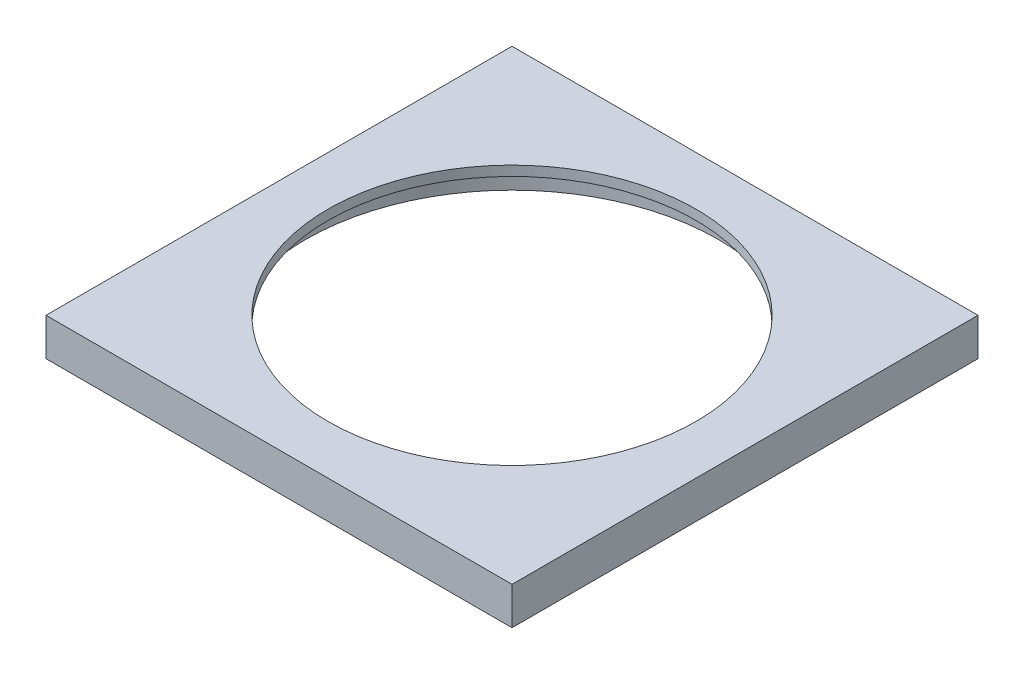
ISO-10303-21;
HEADER;
FILE_DESCRIPTION(('STEP AP214'),'2;1');
FILE_NAME('part.step','',(''),(''),'','','');
FILE_SCHEMA(('AUTOMOTIVE_DESIGN { 1 0 10303 214 1 1 1 1 }'));
ENDSEC;
DATA;
#1=APPLICATION_CONTEXT('core data for automotive mechanical design processes');
#2=APPLICATION_PROTOCOL_DEFINITION('international standard','automotive_design',2000,#1);
#3=PRODUCT_CONTEXT('',#1,'mechanical');
#4=PRODUCT('Part','Part','',(#3));
#5=PRODUCT_RELATED_PRODUCT_CATEGORY('part','',(#4));
#6=PRODUCT_DEFINITION_FORMATION('','',#4);
#7=PRODUCT_DEFINITION_CONTEXT('part definition',#1,'design');
#8=PRODUCT_DEFINITION('design','',#6,#7);
#9=PRODUCT_DEFINITION_SHAPE('','',#8);
#10=(LENGTH_UNIT() NAMED_UNIT(*) SI_UNIT(.MILLI.,.METRE.));
#11=(NAMED_UNIT(*) PLANE_ANGLE_UNIT() SI_UNIT($,.RADIAN.));
#12=(NAMED_UNIT(*) SI_UNIT($,.STERADIAN.) SOLID_ANGLE_UNIT());
#13=UNCERTAINTY_MEASURE_WITH_UNIT(LENGTH_MEASURE(1.E-05),#10,'distance_accuracy_value','');
#14=(GEOMETRIC_REPRESENTATION_CONTEXT(3) GLOBAL_UNCERTAINTY_ASSIGNED_CONTEXT((#13)) GLOBAL_UNIT_ASSIGNED_CONTEXT((#10,
#11,#12)) REPRESENTATION_CONTEXT('',''));
#15=CARTESIAN_POINT('',(0.,0.,0.));
#16=DIRECTION('',(0.,0.,1.));
#17=DIRECTION('',(1.,0.,0.));
#18=AXIS2_PLACEMENT_3D('',#15,#16,#17);
#19=CARTESIAN_POINT('',(0.,3.4,28.5));
#20=DIRECTION('',(0.,0.,-1.));
#21=DIRECTION('',(-1.,0.,0.));
#22=AXIS2_PLACEMENT_3D('',#19,#20,#21);
#23=PLANE('',#22);
#24=DIRECTION('',(1.,0.,0.));
#25=VECTOR('',#24,1.);
#26=CARTESIAN_POINT('',(0.,0.,28.5));
#27=LINE('',#26,#25);
#28=CARTESIAN_POINT('',(-28.5,0.,28.5));
#29=VERTEX_POINT('',#28);
#30=CARTESIAN_POINT('',(28.5,0.,28.5));
#31=VERTEX_POINT('',#30);
#32=EDGE_CURVE('E132',#29,#31,#27,.T.);
#33=ORIENTED_EDGE('',*,*,#32,.T.);
#34=DIRECTION('',(0.,-1.,0.));
#35=VECTOR('',#34,1.);
#36=CARTESIAN_POINT('',(28.5,3.4,28.5));
#37=LINE('',#36,#35);
#38=CARTESIAN_POINT('',(28.5,4.6,28.5));
#39=VERTEX_POINT('',#38);
#40=EDGE_CURVE('E12',#39,#31,#37,.T.);
#41=ORIENTED_EDGE('',*,*,#40,.F.);
#42=DIRECTION('',(-1.,0.,0.));
#43=VECTOR('',#42,1.);
#44=CARTESIAN_POINT('',(0.,4.6,28.5));
#45=LINE('',#44,#43);
#46=CARTESIAN_POINT('',(-28.5,4.6,28.5));
#47=VERTEX_POINT('',#46);
#48=EDGE_CURVE('E108',#39,#47,#45,.T.);
#49=ORIENTED_EDGE('',*,*,#48,.T.);
#50=DIRECTION('',(0.,-1.,0.));
#51=VECTOR('',#50,1.);
#52=CARTESIAN_POINT('',(-28.5,3.4,28.5));
#53=LINE('',#52,#51);
#54=EDGE_CURVE('E70',#47,#29,#53,.T.);
#55=ORIENTED_EDGE('',*,*,#54,.T.);
#56=EDGE_LOOP('',(#33,#41,#49,#55));
#57=FACE_BOUND('',#56,.T.);
#58=ADVANCED_FACE('F54',(#57),#23,.F.);
#59=CARTESIAN_POINT('',(28.5,3.4,0.));
#60=DIRECTION('',(-1.,0.,0.));
#61=DIRECTION('',(0.,0.,1.));
#62=AXIS2_PLACEMENT_3D('',#59,#60,#61);
#63=PLANE('',#62);
#64=DIRECTION('',(0.,0.,-1.));
#65=VECTOR('',#64,1.);
#66=CARTESIAN_POINT('',(28.5,0.,0.));
#67=LINE('',#66,#65);
#68=CARTESIAN_POINT('',(28.5,0.,-28.5));
#69=VERTEX_POINT('',#68);
#70=EDGE_CURVE('E135',#31,#69,#67,.T.);
#71=ORIENTED_EDGE('',*,*,#70,.T.);
#72=DIRECTION('',(0.,-1.,0.));
#73=VECTOR('',#72,1.);
#74=CARTESIAN_POINT('',(28.5,3.4,-28.5));
#75=LINE('',#74,#73);
#76=CARTESIAN_POINT('',(28.5,4.6,-28.5));
#77=VERTEX_POINT('',#76);
#78=EDGE_CURVE('E63',#77,#69,#75,.T.);
#79=ORIENTED_EDGE('',*,*,#78,.F.);
#80=DIRECTION('',(0.,0.,1.));
#81=VECTOR('',#80,1.);
#82=CARTESIAN_POINT('',(28.5,4.6,0.));
#83=LINE('',#82,#81);
#84=EDGE_CURVE('E116',#77,#39,#83,.T.);
#85=ORIENTED_EDGE('',*,*,#84,.T.);
#86=ORIENTED_EDGE('',*,*,#40,.T.);
#87=EDGE_LOOP('',(#71,#79,#85,#86));
#88=FACE_BOUND('',#87,.T.);
#89=ADVANCED_FACE('F150',(#88),#63,.F.);
#90=CARTESIAN_POINT('',(0.,3.4,-28.5));
#91=DIRECTION('',(0.,0.,-1.));
#92=DIRECTION('',(-1.,0.,0.));
#93=AXIS2_PLACEMENT_3D('',#90,#91,#92);
#94=PLANE('',#93);
#95=DIRECTION('',(1.,0.,0.));
#96=VECTOR('',#95,1.);
#97=CARTESIAN_POINT('',(0.,0.,-28.5));
#98=LINE('',#97,#96);
#99=CARTESIAN_POINT('',(-28.5,0.,-28.5));
#100=VERTEX_POINT('',#99);
#101=EDGE_CURVE('E139',#100,#69,#98,.T.);
#102=ORIENTED_EDGE('',*,*,#101,.F.);
#103=DIRECTION('',(0.,-1.,0.));
#104=VECTOR('',#103,1.);
#105=CARTESIAN_POINT('',(-28.5,3.4,-28.5));
#106=LINE('',#105,#104);
#107=CARTESIAN_POINT('',(-28.5,4.6,-28.5));
#108=VERTEX_POINT('',#107);
#109=EDGE_CURVE('E78',#108,#100,#106,.T.);
#110=ORIENTED_EDGE('',*,*,#109,.F.);
#111=DIRECTION('',(-1.,0.,0.));
#112=VECTOR('',#111,1.);
#113=CARTESIAN_POINT('',(0.,4.6,-28.5));
#114=LINE('',#113,#112);
#115=EDGE_CURVE('E111',#77,#108,#114,.T.);
#116=ORIENTED_EDGE('',*,*,#115,.F.);
#117=ORIENTED_EDGE('',*,*,#78,.T.);
#118=EDGE_LOOP('',(#102,#110,#116,#117));
#119=FACE_BOUND('',#118,.T.);
#120=ADVANCED_FACE('F148',(#119),#94,.T.);
#121=CARTESIAN_POINT('',(0.,3.4,0.));
#122=DIRECTION('',(0.,-1.,0.));
#123=DIRECTION('',(0.,0.,-1.));
#124=AXIS2_PLACEMENT_3D('',#121,#122,#123);
#125=CYLINDRICAL_SURFACE('',#124,25.25);
#126=CARTESIAN_POINT('',(0.,3.4,0.));
#127=DIRECTION('',(0.,1.,0.));
#128=DIRECTION('',(0.,0.,1.));
#129=AXIS2_PLACEMENT_3D('',#126,#127,#128);
#130=CIRCLE('',#129,25.25);
#131=CARTESIAN_POINT('',(0.,3.4,25.25));
#132=VERTEX_POINT('',#131);
#133=EDGE_CURVE('E124',#132,#132,#130,.T.);
#134=ORIENTED_EDGE('',*,*,#133,.T.);
#135=EDGE_LOOP('',(#134));
#136=FACE_BOUND('',#135,.T.);
#137=CARTESIAN_POINT('',(0.,0.,0.));
#138=DIRECTION('',(0.,1.,0.));
#139=DIRECTION('',(0.,0.,1.));
#140=AXIS2_PLACEMENT_3D('',#137,#138,#139);
#141=CIRCLE('',#140,25.25);
#142=CARTESIAN_POINT('',(0.,0.,25.25));
#143=VERTEX_POINT('',#142);
#144=EDGE_CURVE('E128',#143,#143,#141,.T.);
#145=ORIENTED_EDGE('',*,*,#144,.F.);
#146=EDGE_LOOP('',(#145));
#147=FACE_BOUND('',#146,.T.);
#148=ADVANCED_FACE('F56',(#136,#147),#125,.F.);
#149=CARTESIAN_POINT('',(-28.5,3.4,0.));
#150=DIRECTION('',(-1.,0.,0.));
#151=DIRECTION('',(0.,0.,1.));
#152=AXIS2_PLACEMENT_3D('',#149,#150,#151);
#153=PLANE('',#152);
#154=DIRECTION('',(0.,0.,-1.));
#155=VECTOR('',#154,1.);
#156=CARTESIAN_POINT('',(-28.5,0.,0.));
#157=LINE('',#156,#155);
#158=EDGE_CURVE('E99',#29,#100,#157,.T.);
#159=ORIENTED_EDGE('',*,*,#158,.F.);
#160=ORIENTED_EDGE('',*,*,#54,.F.);
#161=DIRECTION('',(0.,0.,1.));
#162=VECTOR('',#161,1.);
#163=CARTESIAN_POINT('',(-28.5,4.6,0.));
#164=LINE('',#163,#162);
#165=EDGE_CURVE('E97',#108,#47,#164,.T.);
#166=ORIENTED_EDGE('',*,*,#165,.F.);
#167=ORIENTED_EDGE('',*,*,#109,.T.);
#168=EDGE_LOOP('',(#159,#160,#166,#167));
#169=FACE_BOUND('',#168,.T.);
#170=ADVANCED_FACE('F96',(#169),#153,.T.);
#171=CARTESIAN_POINT('',(0.,0.,0.));
#172=DIRECTION('',(0.,1.,0.));
#173=DIRECTION('',(0.,0.,1.));
#174=AXIS2_PLACEMENT_3D('',#171,#172,#173);
#175=PLANE('',#174);
#176=ORIENTED_EDGE('',*,*,#144,.T.);
#177=EDGE_LOOP('',(#176));
#178=FACE_BOUND('',#177,.T.);
#179=ORIENTED_EDGE('',*,*,#32,.F.);
#180=ORIENTED_EDGE('',*,*,#158,.T.);
#181=ORIENTED_EDGE('',*,*,#101,.T.);
#182=ORIENTED_EDGE('',*,*,#70,.F.);
#183=EDGE_LOOP('',(#179,#180,#181,#182));
#184=FACE_BOUND('',#183,.T.);
#185=ADVANCED_FACE('F152',(#178,#184),#175,.F.);
#186=CARTESIAN_POINT('',(0.,3.4,0.));
#187=DIRECTION('',(0.,-1.,0.));
#188=DIRECTION('',(0.,0.,-1.));
#189=AXIS2_PLACEMENT_3D('',#186,#187,#188);
#190=PLANE('',#189);
#191=CARTESIAN_POINT('',(0.,3.4,0.));
#192=DIRECTION('',(0.,1.,0.));
#193=DIRECTION('',(0.,0.,1.));
#194=AXIS2_PLACEMENT_3D('',#191,#192,#193);
#195=CIRCLE('',#194,22.5);
#196=CARTESIAN_POINT('',(0.,3.4,22.5));
#197=VERTEX_POINT('',#196);
#198=EDGE_CURVE('E224',#197,#197,#195,.T.);
#199=ORIENTED_EDGE('',*,*,#198,.T.);
#200=EDGE_LOOP('',(#199));
#201=FACE_BOUND('',#200,.T.);
#202=ORIENTED_EDGE('',*,*,#133,.F.);
#203=EDGE_LOOP('',(#202));
#204=FACE_BOUND('',#203,.T.);
#205=ADVANCED_FACE('F154',(#201,#204),#190,.T.);
#206=CARTESIAN_POINT('',(0.,4.6,0.));
#207=DIRECTION('',(0.,-1.,0.));
#208=DIRECTION('',(0.,0.,-1.));
#209=AXIS2_PLACEMENT_3D('',#206,#207,#208);
#210=PLANE('',#209);
#211=ORIENTED_EDGE('',*,*,#165,.T.);
#212=ORIENTED_EDGE('',*,*,#48,.F.);
#213=ORIENTED_EDGE('',*,*,#84,.F.);
#214=ORIENTED_EDGE('',*,*,#115,.T.);
#215=EDGE_LOOP('',(#211,#212,#213,#214));
#216=FACE_BOUND('',#215,.T.);
#217=CARTESIAN_POINT('',(0.,4.6,0.));
#218=DIRECTION('',(0.,1.,0.));
#219=DIRECTION('',(0.,0.,1.));
#220=AXIS2_PLACEMENT_3D('',#217,#218,#219);
#221=CIRCLE('',#220,22.5);
#222=CARTESIAN_POINT('',(0.,4.6,22.5));
#223=VERTEX_POINT('',#222);
#224=EDGE_CURVE('E113',#223,#223,#221,.T.);
#225=ORIENTED_EDGE('',*,*,#224,.F.);
#226=EDGE_LOOP('',(#225));
#227=FACE_BOUND('',#226,.T.);
#228=ADVANCED_FACE('F105',(#216,#227),#210,.F.);
#229=CARTESIAN_POINT('',(0.,4.6,0.));
#230=DIRECTION('',(0.,-1.,0.));
#231=DIRECTION('',(0.,0.,-1.));
#232=AXIS2_PLACEMENT_3D('',#229,#230,#231);
#233=CYLINDRICAL_SURFACE('',#232,22.5);
#234=ORIENTED_EDGE('',*,*,#224,.T.);
#235=EDGE_LOOP('',(#234));
#236=FACE_BOUND('',#235,.T.);
#237=ORIENTED_EDGE('',*,*,#198,.F.);
#238=EDGE_LOOP('',(#237));
#239=FACE_BOUND('',#238,.T.);
#240=ADVANCED_FACE('F206',(#236,#239),#233,.F.);
#241=CLOSED_SHELL('',(#58,#89,#120,#148,#170,#185,#205,#228,#240));
#242=MANIFOLD_SOLID_BREP('B2',#241);
#243=ADVANCED_BREP_SHAPE_REPRESENTATION('',(#18,#242),#14);
#244=SHAPE_DEFINITION_REPRESENTATION(#9,#243);
ENDSEC;
END-ISO-10303-21;
